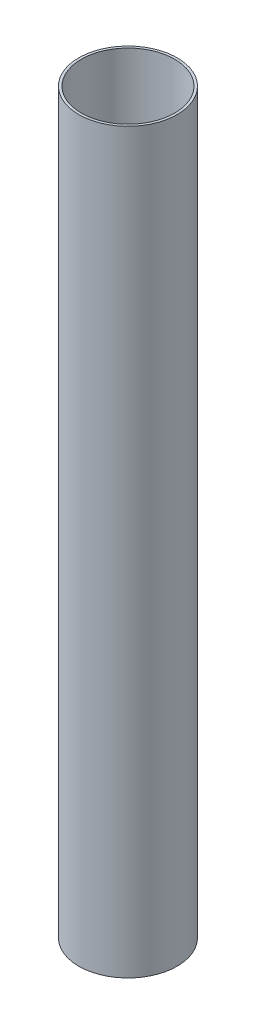
ISO-10303-21;
HEADER;
FILE_DESCRIPTION(('STEP AP214'),'2;1');
FILE_NAME('part.step','',(''),(''),'','','');
FILE_SCHEMA(('AUTOMOTIVE_DESIGN { 1 0 10303 214 1 1 1 1 }'));
ENDSEC;
DATA;
#1=APPLICATION_CONTEXT('core data for automotive mechanical design processes');
#2=APPLICATION_PROTOCOL_DEFINITION('international standard','automotive_design',2000,#1);
#3=PRODUCT_CONTEXT('',#1,'mechanical');
#4=PRODUCT('Part','Part','',(#3));
#5=PRODUCT_RELATED_PRODUCT_CATEGORY('part','',(#4));
#6=PRODUCT_DEFINITION_FORMATION('','',#4);
#7=PRODUCT_DEFINITION_CONTEXT('part definition',#1,'design');
#8=PRODUCT_DEFINITION('design','',#6,#7);
#9=PRODUCT_DEFINITION_SHAPE('','',#8);
#10=(LENGTH_UNIT() NAMED_UNIT(*) SI_UNIT(.MILLI.,.METRE.));
#11=(NAMED_UNIT(*) PLANE_ANGLE_UNIT() SI_UNIT($,.RADIAN.));
#12=(NAMED_UNIT(*) SI_UNIT($,.STERADIAN.) SOLID_ANGLE_UNIT());
#13=UNCERTAINTY_MEASURE_WITH_UNIT(LENGTH_MEASURE(1.E-05),#10,'distance_accuracy_value','');
#14=(GEOMETRIC_REPRESENTATION_CONTEXT(3) GLOBAL_UNCERTAINTY_ASSIGNED_CONTEXT((#13)) GLOBAL_UNIT_ASSIGNED_CONTEXT((#10,
#11,#12)) REPRESENTATION_CONTEXT('',''));
#15=CARTESIAN_POINT('',(0.,0.,0.));
#16=DIRECTION('',(0.,0.,1.));
#17=DIRECTION('',(1.,0.,0.));
#18=AXIS2_PLACEMENT_3D('',#15,#16,#17);
#19=CARTESIAN_POINT('',(0.,600.,0.));
#20=DIRECTION('',(0.,1.,0.));
#21=DIRECTION('',(0.,0.,1.));
#22=AXIS2_PLACEMENT_3D('',#19,#20,#21);
#23=PLANE('',#22);
#24=CARTESIAN_POINT('',(0.,600.,0.));
#25=DIRECTION('',(0.,1.,0.));
#26=DIRECTION('',(0.,0.,1.));
#27=AXIS2_PLACEMENT_3D('',#24,#25,#26);
#28=CIRCLE('',#27,40.);
#29=CARTESIAN_POINT('',(0.,600.,40.));
#30=VERTEX_POINT('',#29);
#31=EDGE_CURVE('E10',#30,#30,#28,.T.);
#32=ORIENTED_EDGE('',*,*,#31,.T.);
#33=EDGE_LOOP('',(#32));
#34=FACE_BOUND('',#33,.T.);
#35=CARTESIAN_POINT('',(0.,600.,0.));
#36=DIRECTION('',(0.,1.,0.));
#37=DIRECTION('',(0.,0.,1.));
#38=AXIS2_PLACEMENT_3D('',#35,#36,#37);
#39=CIRCLE('',#38,38.);
#40=CARTESIAN_POINT('',(0.,600.,38.));
#41=VERTEX_POINT('',#40);
#42=EDGE_CURVE('E44',#41,#41,#39,.T.);
#43=ORIENTED_EDGE('',*,*,#42,.F.);
#44=EDGE_LOOP('',(#43));
#45=FACE_BOUND('',#44,.T.);
#46=ADVANCED_FACE('F33',(#34,#45),#23,.T.);
#47=CARTESIAN_POINT('',(0.,0.,0.));
#48=DIRECTION('',(0.,1.,0.));
#49=DIRECTION('',(0.,0.,1.));
#50=AXIS2_PLACEMENT_3D('',#47,#48,#49);
#51=PLANE('',#50);
#52=CARTESIAN_POINT('',(0.,0.,0.));
#53=DIRECTION('',(0.,1.,0.));
#54=DIRECTION('',(0.,0.,1.));
#55=AXIS2_PLACEMENT_3D('',#52,#53,#54);
#56=CIRCLE('',#55,40.);
#57=CARTESIAN_POINT('',(0.,0.,40.));
#58=VERTEX_POINT('',#57);
#59=EDGE_CURVE('E37',#58,#58,#56,.T.);
#60=ORIENTED_EDGE('',*,*,#59,.F.);
#61=EDGE_LOOP('',(#60));
#62=FACE_BOUND('',#61,.T.);
#63=CARTESIAN_POINT('',(0.,0.,0.));
#64=DIRECTION('',(0.,1.,0.));
#65=DIRECTION('',(0.,0.,1.));
#66=AXIS2_PLACEMENT_3D('',#63,#64,#65);
#67=CIRCLE('',#66,38.);
#68=CARTESIAN_POINT('',(0.,0.,38.));
#69=VERTEX_POINT('',#68);
#70=EDGE_CURVE('E46',#69,#69,#67,.T.);
#71=ORIENTED_EDGE('',*,*,#70,.T.);
#72=EDGE_LOOP('',(#71));
#73=FACE_BOUND('',#72,.T.);
#74=ADVANCED_FACE('F56',(#62,#73),#51,.F.);
#75=CARTESIAN_POINT('',(0.,600.,0.));
#76=DIRECTION('',(0.,-1.,0.));
#77=DIRECTION('',(0.,0.,-1.));
#78=AXIS2_PLACEMENT_3D('',#75,#76,#77);
#79=CYLINDRICAL_SURFACE('',#78,40.);
#80=ORIENTED_EDGE('',*,*,#31,.F.);
#81=EDGE_LOOP('',(#80));
#82=FACE_BOUND('',#81,.T.);
#83=ORIENTED_EDGE('',*,*,#59,.T.);
#84=EDGE_LOOP('',(#83));
#85=FACE_BOUND('',#84,.T.);
#86=ADVANCED_FACE('F35',(#82,#85),#79,.T.);
#87=CARTESIAN_POINT('',(0.,600.,0.));
#88=DIRECTION('',(0.,-1.,0.));
#89=DIRECTION('',(0.,0.,-1.));
#90=AXIS2_PLACEMENT_3D('',#87,#88,#89);
#91=CYLINDRICAL_SURFACE('',#90,38.);
#92=ORIENTED_EDGE('',*,*,#42,.T.);
#93=EDGE_LOOP('',(#92));
#94=FACE_BOUND('',#93,.T.);
#95=ORIENTED_EDGE('',*,*,#70,.F.);
#96=EDGE_LOOP('',(#95));
#97=FACE_BOUND('',#96,.T.);
#98=ADVANCED_FACE('F52',(#94,#97),#91,.F.);
#99=CLOSED_SHELL('',(#46,#74,#86,#98));
#100=MANIFOLD_SOLID_BREP('B2',#99);
#101=ADVANCED_BREP_SHAPE_REPRESENTATION('',(#18,#100),#14);
#102=SHAPE_DEFINITION_REPRESENTATION(#9,#101);
ENDSEC;
END-ISO-10303-21;
